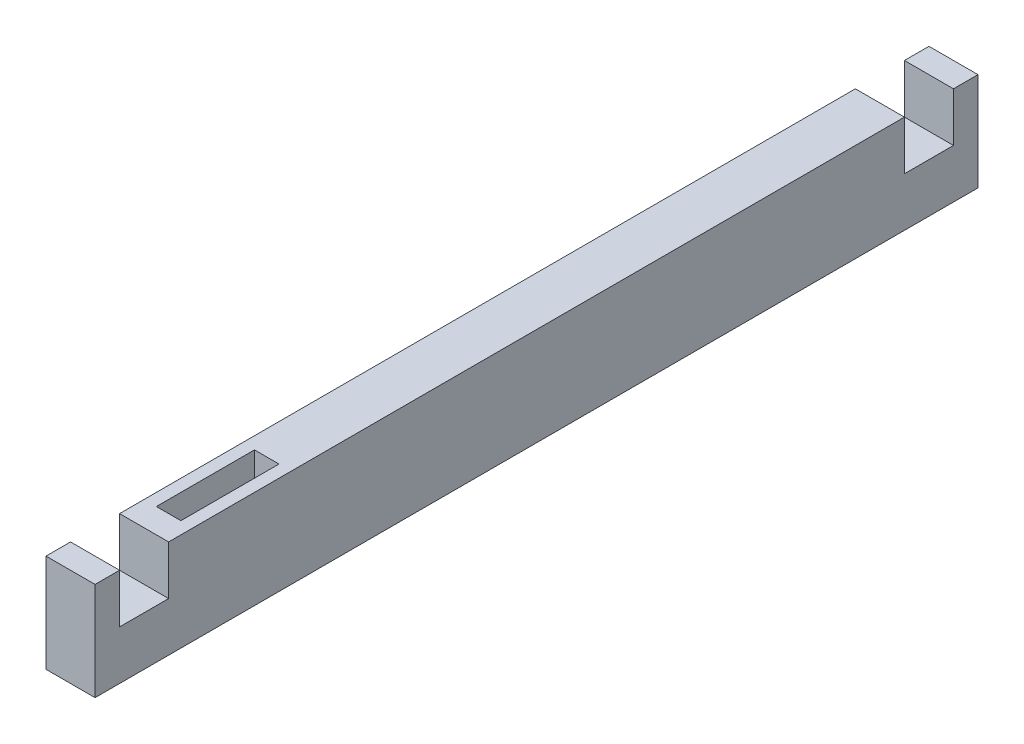
ISO-10303-21;
HEADER;
FILE_DESCRIPTION(('STEP AP214'),'2;1');
FILE_NAME('part.step','',(''),(''),'','','');
FILE_SCHEMA(('AUTOMOTIVE_DESIGN { 1 0 10303 214 1 1 1 1 }'));
ENDSEC;
DATA;
#1=APPLICATION_CONTEXT('core data for automotive mechanical design processes');
#2=APPLICATION_PROTOCOL_DEFINITION('international standard','automotive_design',2000,#1);
#3=PRODUCT_CONTEXT('',#1,'mechanical');
#4=PRODUCT('Part','Part','',(#3));
#5=PRODUCT_RELATED_PRODUCT_CATEGORY('part','',(#4));
#6=PRODUCT_DEFINITION_FORMATION('','',#4);
#7=PRODUCT_DEFINITION_CONTEXT('part definition',#1,'design');
#8=PRODUCT_DEFINITION('design','',#6,#7);
#9=PRODUCT_DEFINITION_SHAPE('','',#8);
#10=(LENGTH_UNIT() NAMED_UNIT(*) SI_UNIT(.MILLI.,.METRE.));
#11=(NAMED_UNIT(*) PLANE_ANGLE_UNIT() SI_UNIT($,.RADIAN.));
#12=(NAMED_UNIT(*) SI_UNIT($,.STERADIAN.) SOLID_ANGLE_UNIT());
#13=UNCERTAINTY_MEASURE_WITH_UNIT(LENGTH_MEASURE(1.E-05),#10,'distance_accuracy_value','');
#14=(GEOMETRIC_REPRESENTATION_CONTEXT(3) GLOBAL_UNCERTAINTY_ASSIGNED_CONTEXT((#13)) GLOBAL_UNIT_ASSIGNED_CONTEXT((#10,
#11,#12)) REPRESENTATION_CONTEXT('',''));
#15=CARTESIAN_POINT('',(0.,0.,0.));
#16=DIRECTION('',(0.,0.,1.));
#17=DIRECTION('',(1.,0.,0.));
#18=AXIS2_PLACEMENT_3D('',#15,#16,#17);
#19=CARTESIAN_POINT('',(25.4,-50.8,914.4));
#20=DIRECTION('',(-1.,0.,0.));
#21=DIRECTION('',(0.,-1.,0.));
#22=AXIS2_PLACEMENT_3D('',#19,#20,#21);
#23=PLANE('',#22);
#24=DIRECTION('',(0.,1.,0.));
#25=VECTOR('',#24,1.);
#26=CARTESIAN_POINT('',(25.4,-50.8,25.3999999999998));
#27=LINE('',#26,#25);
#28=CARTESIAN_POINT('',(25.4,0.,25.3999999999998));
#29=VERTEX_POINT('',#28);
#30=CARTESIAN_POINT('',(25.4,50.8,25.3999999999998));
#31=VERTEX_POINT('',#30);
#32=EDGE_CURVE('E214',#29,#31,#27,.T.);
#33=ORIENTED_EDGE('',*,*,#32,.F.);
#34=DIRECTION('',(0.,0.,-1.));
#35=VECTOR('',#34,1.);
#36=CARTESIAN_POINT('',(25.4,0.,914.4));
#37=LINE('',#36,#35);
#38=CARTESIAN_POINT('',(25.4,0.,76.1999999999999));
#39=VERTEX_POINT('',#38);
#40=EDGE_CURVE('E212',#39,#29,#37,.T.);
#41=ORIENTED_EDGE('',*,*,#40,.F.);
#42=DIRECTION('',(0.,-1.,0.));
#43=VECTOR('',#42,1.);
#44=CARTESIAN_POINT('',(25.4,-50.8,76.1999999999999));
#45=LINE('',#44,#43);
#46=CARTESIAN_POINT('',(25.4,50.8,76.1999999999999));
#47=VERTEX_POINT('',#46);
#48=EDGE_CURVE('E203',#47,#39,#45,.T.);
#49=ORIENTED_EDGE('',*,*,#48,.F.);
#50=DIRECTION('',(0.,0.,-1.));
#51=VECTOR('',#50,1.);
#52=CARTESIAN_POINT('',(25.4,50.8,914.4));
#53=LINE('',#52,#51);
#54=CARTESIAN_POINT('',(25.4,50.8,838.2));
#55=VERTEX_POINT('',#54);
#56=EDGE_CURVE('E50',#55,#47,#53,.T.);
#57=ORIENTED_EDGE('',*,*,#56,.F.);
#58=DIRECTION('',(0.,-1.,0.));
#59=VECTOR('',#58,1.);
#60=CARTESIAN_POINT('',(25.4,-50.8,838.2));
#61=LINE('',#60,#59);
#62=CARTESIAN_POINT('',(25.4,0.,838.2));
#63=VERTEX_POINT('',#62);
#64=EDGE_CURVE('E239',#55,#63,#61,.T.);
#65=ORIENTED_EDGE('',*,*,#64,.T.);
#66=DIRECTION('',(0.,0.,1.));
#67=VECTOR('',#66,1.);
#68=CARTESIAN_POINT('',(25.4,0.,914.4));
#69=LINE('',#68,#67);
#70=CARTESIAN_POINT('',(25.4,0.,889.));
#71=VERTEX_POINT('',#70);
#72=EDGE_CURVE('E228',#63,#71,#69,.T.);
#73=ORIENTED_EDGE('',*,*,#72,.T.);
#74=DIRECTION('',(0.,1.,0.));
#75=VECTOR('',#74,1.);
#76=CARTESIAN_POINT('',(25.4,-50.8,889.));
#77=LINE('',#76,#75);
#78=CARTESIAN_POINT('',(25.4,50.8,889.));
#79=VERTEX_POINT('',#78);
#80=EDGE_CURVE('E242',#71,#79,#77,.T.);
#81=ORIENTED_EDGE('',*,*,#80,.T.);
#82=CARTESIAN_POINT('',(25.4,50.8,914.4));
#83=VERTEX_POINT('',#82);
#84=EDGE_CURVE('E11',#83,#79,#53,.T.);
#85=ORIENTED_EDGE('',*,*,#84,.F.);
#86=DIRECTION('',(0.,1.,0.));
#87=VECTOR('',#86,1.);
#88=CARTESIAN_POINT('',(25.4,-50.8,914.4));
#89=LINE('',#88,#87);
#90=CARTESIAN_POINT('',(25.4,-50.8,914.4));
#91=VERTEX_POINT('',#90);
#92=EDGE_CURVE('E246',#91,#83,#89,.T.);
#93=ORIENTED_EDGE('',*,*,#92,.F.);
#94=DIRECTION('',(0.,0.,-1.));
#95=VECTOR('',#94,1.);
#96=CARTESIAN_POINT('',(25.4,-50.8,914.4));
#97=LINE('',#96,#95);
#98=CARTESIAN_POINT('',(25.4,-50.8,0.));
#99=VERTEX_POINT('',#98);
#100=EDGE_CURVE('E256',#91,#99,#97,.T.);
#101=ORIENTED_EDGE('',*,*,#100,.T.);
#102=DIRECTION('',(0.,1.,0.));
#103=VECTOR('',#102,1.);
#104=CARTESIAN_POINT('',(25.4,-50.8,0.));
#105=LINE('',#104,#103);
#106=CARTESIAN_POINT('',(25.4,50.8,0.));
#107=VERTEX_POINT('',#106);
#108=EDGE_CURVE('E245',#99,#107,#105,.T.);
#109=ORIENTED_EDGE('',*,*,#108,.T.);
#110=EDGE_CURVE('E51',#31,#107,#53,.T.);
#111=ORIENTED_EDGE('',*,*,#110,.F.);
#112=EDGE_LOOP('',(#33,#41,#49,#57,#65,#73,#81,#85,#93,#101,#109,#111));
#113=FACE_BOUND('',#112,.T.);
#114=ADVANCED_FACE('F43',(#113),#23,.F.);
#115=CARTESIAN_POINT('',(-25.4,50.8,914.4));
#116=DIRECTION('',(0.,-1.,0.));
#117=DIRECTION('',(0.,0.,-1.));
#118=AXIS2_PLACEMENT_3D('',#115,#116,#117);
#119=PLANE('',#118);
#120=DIRECTION('',(1.,0.,0.));
#121=VECTOR('',#120,1.);
#122=CARTESIAN_POINT('',(-25.4,50.8,25.3999999999998));
#123=LINE('',#122,#121);
#124=CARTESIAN_POINT('',(-25.4,50.8,25.3999999999998));
#125=VERTEX_POINT('',#124);
#126=EDGE_CURVE('E199',#125,#31,#123,.T.);
#127=ORIENTED_EDGE('',*,*,#126,.T.);
#128=ORIENTED_EDGE('',*,*,#110,.T.);
#129=DIRECTION('',(-1.,0.,0.));
#130=VECTOR('',#129,1.);
#131=CARTESIAN_POINT('',(-25.4,50.8,0.));
#132=LINE('',#131,#130);
#133=CARTESIAN_POINT('',(-25.4,50.8,0.));
#134=VERTEX_POINT('',#133);
#135=EDGE_CURVE('E259',#107,#134,#132,.T.);
#136=ORIENTED_EDGE('',*,*,#135,.T.);
#137=DIRECTION('',(0.,0.,-1.));
#138=VECTOR('',#137,1.);
#139=CARTESIAN_POINT('',(-25.4,50.8,914.4));
#140=LINE('',#139,#138);
#141=EDGE_CURVE('E269',#125,#134,#140,.T.);
#142=ORIENTED_EDGE('',*,*,#141,.F.);
#143=EDGE_LOOP('',(#127,#128,#136,#142));
#144=FACE_BOUND('',#143,.T.);
#145=ADVANCED_FACE('F285',(#144),#119,.F.);
#146=DIRECTION('',(1.,0.,0.));
#147=VECTOR('',#146,1.);
#148=CARTESIAN_POINT('',(-12.7,50.8,711.2));
#149=LINE('',#148,#147);
#150=CARTESIAN_POINT('',(-12.7,50.8,711.2));
#151=VERTEX_POINT('',#150);
#152=CARTESIAN_POINT('',(12.7,50.8,711.2));
#153=VERTEX_POINT('',#152);
#154=EDGE_CURVE('E164',#151,#153,#149,.T.);
#155=ORIENTED_EDGE('',*,*,#154,.T.);
#156=DIRECTION('',(0.,0.,1.));
#157=VECTOR('',#156,1.);
#158=CARTESIAN_POINT('',(12.7,50.8,812.8));
#159=LINE('',#158,#157);
#160=CARTESIAN_POINT('',(12.7,50.8,812.8));
#161=VERTEX_POINT('',#160);
#162=EDGE_CURVE('E158',#153,#161,#159,.T.);
#163=ORIENTED_EDGE('',*,*,#162,.T.);
#164=DIRECTION('',(-1.,0.,0.));
#165=VECTOR('',#164,1.);
#166=CARTESIAN_POINT('',(-12.7,50.8,812.8));
#167=LINE('',#166,#165);
#168=CARTESIAN_POINT('',(-12.7,50.8,812.8));
#169=VERTEX_POINT('',#168);
#170=EDGE_CURVE('E167',#161,#169,#167,.T.);
#171=ORIENTED_EDGE('',*,*,#170,.T.);
#172=DIRECTION('',(0.,0.,-1.));
#173=VECTOR('',#172,1.);
#174=CARTESIAN_POINT('',(-12.7,50.8,812.8));
#175=LINE('',#174,#173);
#176=EDGE_CURVE('E58',#169,#151,#175,.T.);
#177=ORIENTED_EDGE('',*,*,#176,.T.);
#178=EDGE_LOOP('',(#155,#163,#171,#177));
#179=FACE_BOUND('',#178,.T.);
#180=DIRECTION('',(1.,0.,0.));
#181=VECTOR('',#180,1.);
#182=CARTESIAN_POINT('',(-25.4,50.8,76.1999999999999));
#183=LINE('',#182,#181);
#184=CARTESIAN_POINT('',(-25.4,50.8,76.1999999999999));
#185=VERTEX_POINT('',#184);
#186=EDGE_CURVE('E207',#185,#47,#183,.T.);
#187=ORIENTED_EDGE('',*,*,#186,.F.);
#188=CARTESIAN_POINT('',(-25.4,50.8,838.2));
#189=VERTEX_POINT('',#188);
#190=EDGE_CURVE('E272',#189,#185,#140,.T.);
#191=ORIENTED_EDGE('',*,*,#190,.F.);
#192=DIRECTION('',(1.,0.,0.));
#193=VECTOR('',#192,1.);
#194=CARTESIAN_POINT('',(-25.4,50.8,838.2));
#195=LINE('',#194,#193);
#196=EDGE_CURVE('E229',#189,#55,#195,.T.);
#197=ORIENTED_EDGE('',*,*,#196,.T.);
#198=ORIENTED_EDGE('',*,*,#56,.T.);
#199=EDGE_LOOP('',(#187,#191,#197,#198));
#200=FACE_BOUND('',#199,.T.);
#201=ADVANCED_FACE('F171',(#179,#200),#119,.F.);
#202=CARTESIAN_POINT('',(-25.4,-50.8,914.4));
#203=DIRECTION('',(1.,0.,0.));
#204=DIRECTION('',(0.,0.,-1.));
#205=AXIS2_PLACEMENT_3D('',#202,#203,#204);
#206=PLANE('',#205);
#207=DIRECTION('',(0.,-1.,0.));
#208=VECTOR('',#207,1.);
#209=CARTESIAN_POINT('',(-25.4,50.8,25.3999999999998));
#210=LINE('',#209,#208);
#211=CARTESIAN_POINT('',(-25.4,0.,25.3999999999998));
#212=VERTEX_POINT('',#211);
#213=EDGE_CURVE('E189',#125,#212,#210,.T.);
#214=ORIENTED_EDGE('',*,*,#213,.F.);
#215=ORIENTED_EDGE('',*,*,#141,.T.);
#216=DIRECTION('',(0.,-1.,0.));
#217=VECTOR('',#216,1.);
#218=CARTESIAN_POINT('',(-25.4,-50.8,0.));
#219=LINE('',#218,#217);
#220=CARTESIAN_POINT('',(-25.4,-50.8,0.));
#221=VERTEX_POINT('',#220);
#222=EDGE_CURVE('E262',#134,#221,#219,.T.);
#223=ORIENTED_EDGE('',*,*,#222,.T.);
#224=DIRECTION('',(0.,0.,-1.));
#225=VECTOR('',#224,1.);
#226=CARTESIAN_POINT('',(-25.4,-50.8,914.4));
#227=LINE('',#226,#225);
#228=CARTESIAN_POINT('',(-25.4,-50.8,914.4));
#229=VERTEX_POINT('',#228);
#230=EDGE_CURVE('E267',#229,#221,#227,.T.);
#231=ORIENTED_EDGE('',*,*,#230,.F.);
#232=DIRECTION('',(0.,-1.,0.));
#233=VECTOR('',#232,1.);
#234=CARTESIAN_POINT('',(-25.4,-50.8,914.4));
#235=LINE('',#234,#233);
#236=CARTESIAN_POINT('',(-25.4,50.8,914.4));
#237=VERTEX_POINT('',#236);
#238=EDGE_CURVE('E252',#237,#229,#235,.T.);
#239=ORIENTED_EDGE('',*,*,#238,.F.);
#240=CARTESIAN_POINT('',(-25.4,50.8,889.));
#241=VERTEX_POINT('',#240);
#242=EDGE_CURVE('E270',#237,#241,#140,.T.);
#243=ORIENTED_EDGE('',*,*,#242,.T.);
#244=DIRECTION('',(0.,-1.,0.));
#245=VECTOR('',#244,1.);
#246=CARTESIAN_POINT('',(-25.4,50.8,889.));
#247=LINE('',#246,#245);
#248=CARTESIAN_POINT('',(-25.4,0.,889.));
#249=VERTEX_POINT('',#248);
#250=EDGE_CURVE('E216',#241,#249,#247,.T.);
#251=ORIENTED_EDGE('',*,*,#250,.T.);
#252=DIRECTION('',(0.,0.,-1.));
#253=VECTOR('',#252,1.);
#254=CARTESIAN_POINT('',(-25.4,0.,889.));
#255=LINE('',#254,#253);
#256=CARTESIAN_POINT('',(-25.4,0.,838.2));
#257=VERTEX_POINT('',#256);
#258=EDGE_CURVE('E219',#249,#257,#255,.T.);
#259=ORIENTED_EDGE('',*,*,#258,.T.);
#260=DIRECTION('',(0.,1.,0.));
#261=VECTOR('',#260,1.);
#262=CARTESIAN_POINT('',(-25.4,50.8,838.2));
#263=LINE('',#262,#261);
#264=EDGE_CURVE('E222',#257,#189,#263,.T.);
#265=ORIENTED_EDGE('',*,*,#264,.T.);
#266=ORIENTED_EDGE('',*,*,#190,.T.);
#267=DIRECTION('',(0.,1.,0.));
#268=VECTOR('',#267,1.);
#269=CARTESIAN_POINT('',(-25.4,50.8,76.1999999999999));
#270=LINE('',#269,#268);
#271=CARTESIAN_POINT('',(-25.4,0.,76.1999999999999));
#272=VERTEX_POINT('',#271);
#273=EDGE_CURVE('E194',#272,#185,#270,.T.);
#274=ORIENTED_EDGE('',*,*,#273,.F.);
#275=DIRECTION('',(0.,0.,1.));
#276=VECTOR('',#275,1.);
#277=CARTESIAN_POINT('',(-25.4,0.,25.3999999999998));
#278=LINE('',#277,#276);
#279=EDGE_CURVE('E196',#212,#272,#278,.T.);
#280=ORIENTED_EDGE('',*,*,#279,.F.);
#281=EDGE_LOOP('',(#214,#215,#223,#231,#239,#243,#251,#259,#265,#266,#274,#280));
#282=FACE_BOUND('',#281,.T.);
#283=ADVANCED_FACE('F279',(#282),#206,.F.);
#284=ORIENTED_EDGE('',*,*,#84,.T.);
#285=DIRECTION('',(1.,0.,0.));
#286=VECTOR('',#285,1.);
#287=CARTESIAN_POINT('',(-25.4,50.8,889.));
#288=LINE('',#287,#286);
#289=EDGE_CURVE('E226',#241,#79,#288,.T.);
#290=ORIENTED_EDGE('',*,*,#289,.F.);
#291=ORIENTED_EDGE('',*,*,#242,.F.);
#292=DIRECTION('',(-1.,0.,0.));
#293=VECTOR('',#292,1.);
#294=CARTESIAN_POINT('',(-25.4,50.8,914.4));
#295=LINE('',#294,#293);
#296=EDGE_CURVE('E249',#83,#237,#295,.T.);
#297=ORIENTED_EDGE('',*,*,#296,.F.);
#298=EDGE_LOOP('',(#284,#290,#291,#297));
#299=FACE_BOUND('',#298,.T.);
#300=ADVANCED_FACE('F303',(#299),#119,.F.);
#301=CARTESIAN_POINT('',(-25.4,-50.8,914.4));
#302=DIRECTION('',(0.,1.,0.));
#303=DIRECTION('',(0.,0.,1.));
#304=AXIS2_PLACEMENT_3D('',#301,#302,#303);
#305=PLANE('',#304);
#306=DIRECTION('',(-1.,0.,0.));
#307=VECTOR('',#306,1.);
#308=CARTESIAN_POINT('',(-12.7,-50.8,812.8));
#309=LINE('',#308,#307);
#310=CARTESIAN_POINT('',(12.7,-50.8,812.8));
#311=VERTEX_POINT('',#310);
#312=CARTESIAN_POINT('',(-12.7,-50.8,812.8));
#313=VERTEX_POINT('',#312);
#314=EDGE_CURVE('E183',#311,#313,#309,.T.);
#315=ORIENTED_EDGE('',*,*,#314,.F.);
#316=DIRECTION('',(0.,0.,1.));
#317=VECTOR('',#316,1.);
#318=CARTESIAN_POINT('',(12.7,-50.8,812.8));
#319=LINE('',#318,#317);
#320=CARTESIAN_POINT('',(12.7,-50.8,711.2));
#321=VERTEX_POINT('',#320);
#322=EDGE_CURVE('E66',#321,#311,#319,.T.);
#323=ORIENTED_EDGE('',*,*,#322,.F.);
#324=DIRECTION('',(1.,0.,0.));
#325=VECTOR('',#324,1.);
#326=CARTESIAN_POINT('',(-12.7,-50.8,711.2));
#327=LINE('',#326,#325);
#328=CARTESIAN_POINT('',(-12.7,-50.8,711.2));
#329=VERTEX_POINT('',#328);
#330=EDGE_CURVE('E174',#329,#321,#327,.T.);
#331=ORIENTED_EDGE('',*,*,#330,.F.);
#332=DIRECTION('',(0.,0.,-1.));
#333=VECTOR('',#332,1.);
#334=CARTESIAN_POINT('',(-12.7,-50.8,812.8));
#335=LINE('',#334,#333);
#336=EDGE_CURVE('E177',#313,#329,#335,.T.);
#337=ORIENTED_EDGE('',*,*,#336,.F.);
#338=EDGE_LOOP('',(#315,#323,#331,#337));
#339=FACE_BOUND('',#338,.T.);
#340=DIRECTION('',(1.,0.,0.));
#341=VECTOR('',#340,1.);
#342=CARTESIAN_POINT('',(-25.4,-50.8,0.));
#343=LINE('',#342,#341);
#344=EDGE_CURVE('E250',#221,#99,#343,.T.);
#345=ORIENTED_EDGE('',*,*,#344,.T.);
#346=ORIENTED_EDGE('',*,*,#100,.F.);
#347=DIRECTION('',(1.,0.,0.));
#348=VECTOR('',#347,1.);
#349=CARTESIAN_POINT('',(-25.4,-50.8,914.4));
#350=LINE('',#349,#348);
#351=EDGE_CURVE('E254',#229,#91,#350,.T.);
#352=ORIENTED_EDGE('',*,*,#351,.F.);
#353=ORIENTED_EDGE('',*,*,#230,.T.);
#354=EDGE_LOOP('',(#345,#346,#352,#353));
#355=FACE_BOUND('',#354,.T.);
#356=ADVANCED_FACE('F293',(#339,#355),#305,.F.);
#357=CARTESIAN_POINT('',(0.,0.,914.4));
#358=DIRECTION('',(0.,0.,-1.));
#359=DIRECTION('',(-1.,0.,0.));
#360=AXIS2_PLACEMENT_3D('',#357,#358,#359);
#361=PLANE('',#360);
#362=ORIENTED_EDGE('',*,*,#92,.T.);
#363=ORIENTED_EDGE('',*,*,#296,.T.);
#364=ORIENTED_EDGE('',*,*,#238,.T.);
#365=ORIENTED_EDGE('',*,*,#351,.T.);
#366=EDGE_LOOP('',(#362,#363,#364,#365));
#367=FACE_BOUND('',#366,.T.);
#368=ADVANCED_FACE('F300',(#367),#361,.F.);
#369=CARTESIAN_POINT('',(0.,0.,0.));
#370=DIRECTION('',(0.,0.,-1.));
#371=DIRECTION('',(-1.,0.,0.));
#372=AXIS2_PLACEMENT_3D('',#369,#370,#371);
#373=PLANE('',#372);
#374=ORIENTED_EDGE('',*,*,#108,.F.);
#375=ORIENTED_EDGE('',*,*,#344,.F.);
#376=ORIENTED_EDGE('',*,*,#222,.F.);
#377=ORIENTED_EDGE('',*,*,#135,.F.);
#378=EDGE_LOOP('',(#374,#375,#376,#377));
#379=FACE_BOUND('',#378,.T.);
#380=ADVANCED_FACE('F290',(#379),#373,.T.);
#381=CARTESIAN_POINT('',(-25.4,50.8,889.));
#382=DIRECTION('',(0.,0.,1.));
#383=DIRECTION('',(1.,0.,0.));
#384=AXIS2_PLACEMENT_3D('',#381,#382,#383);
#385=PLANE('',#384);
#386=DIRECTION('',(1.,0.,0.));
#387=VECTOR('',#386,1.);
#388=CARTESIAN_POINT('',(-25.4,0.,889.));
#389=LINE('',#388,#387);
#390=EDGE_CURVE('E225',#249,#71,#389,.T.);
#391=ORIENTED_EDGE('',*,*,#390,.F.);
#392=ORIENTED_EDGE('',*,*,#250,.F.);
#393=ORIENTED_EDGE('',*,*,#289,.T.);
#394=ORIENTED_EDGE('',*,*,#80,.F.);
#395=EDGE_LOOP('',(#391,#392,#393,#394));
#396=FACE_BOUND('',#395,.T.);
#397=ADVANCED_FACE('F305',(#396),#385,.F.);
#398=CARTESIAN_POINT('',(-25.4,50.8,838.2));
#399=DIRECTION('',(0.,0.,-1.));
#400=DIRECTION('',(-1.,0.,0.));
#401=AXIS2_PLACEMENT_3D('',#398,#399,#400);
#402=PLANE('',#401);
#403=ORIENTED_EDGE('',*,*,#196,.F.);
#404=ORIENTED_EDGE('',*,*,#264,.F.);
#405=DIRECTION('',(1.,0.,0.));
#406=VECTOR('',#405,1.);
#407=CARTESIAN_POINT('',(-25.4,0.,838.2));
#408=LINE('',#407,#406);
#409=EDGE_CURVE('E232',#257,#63,#408,.T.);
#410=ORIENTED_EDGE('',*,*,#409,.T.);
#411=ORIENTED_EDGE('',*,*,#64,.F.);
#412=EDGE_LOOP('',(#403,#404,#410,#411));
#413=FACE_BOUND('',#412,.T.);
#414=ADVANCED_FACE('F312',(#413),#402,.F.);
#415=CARTESIAN_POINT('',(-25.4,0.,889.));
#416=DIRECTION('',(0.,-1.,0.));
#417=DIRECTION('',(1.,0.,0.));
#418=AXIS2_PLACEMENT_3D('',#415,#416,#417);
#419=PLANE('',#418);
#420=ORIENTED_EDGE('',*,*,#409,.F.);
#421=ORIENTED_EDGE('',*,*,#258,.F.);
#422=ORIENTED_EDGE('',*,*,#390,.T.);
#423=ORIENTED_EDGE('',*,*,#72,.F.);
#424=EDGE_LOOP('',(#420,#421,#422,#423));
#425=FACE_BOUND('',#424,.T.);
#426=ADVANCED_FACE('F309',(#425),#419,.F.);
#427=CARTESIAN_POINT('',(-25.4,50.8,25.3999999999998));
#428=DIRECTION('',(0.,0.,1.));
#429=DIRECTION('',(1.,0.,0.));
#430=AXIS2_PLACEMENT_3D('',#427,#428,#429);
#431=PLANE('',#430);
#432=ORIENTED_EDGE('',*,*,#32,.T.);
#433=ORIENTED_EDGE('',*,*,#126,.F.);
#434=ORIENTED_EDGE('',*,*,#213,.T.);
#435=DIRECTION('',(1.,0.,0.));
#436=VECTOR('',#435,1.);
#437=CARTESIAN_POINT('',(-25.4,0.,25.3999999999998));
#438=LINE('',#437,#436);
#439=EDGE_CURVE('E200',#212,#29,#438,.T.);
#440=ORIENTED_EDGE('',*,*,#439,.T.);
#441=EDGE_LOOP('',(#432,#433,#434,#440));
#442=FACE_BOUND('',#441,.T.);
#443=ADVANCED_FACE('F325',(#442),#431,.T.);
#444=CARTESIAN_POINT('',(-25.4,0.,25.3999999999998));
#445=DIRECTION('',(0.,1.,0.));
#446=DIRECTION('',(-1.,0.,0.));
#447=AXIS2_PLACEMENT_3D('',#444,#445,#446);
#448=PLANE('',#447);
#449=ORIENTED_EDGE('',*,*,#40,.T.);
#450=ORIENTED_EDGE('',*,*,#439,.F.);
#451=ORIENTED_EDGE('',*,*,#279,.T.);
#452=DIRECTION('',(1.,0.,0.));
#453=VECTOR('',#452,1.);
#454=CARTESIAN_POINT('',(-25.4,0.,76.1999999999999));
#455=LINE('',#454,#453);
#456=EDGE_CURVE('E204',#272,#39,#455,.T.);
#457=ORIENTED_EDGE('',*,*,#456,.T.);
#458=EDGE_LOOP('',(#449,#450,#451,#457));
#459=FACE_BOUND('',#458,.T.);
#460=ADVANCED_FACE('F323',(#459),#448,.T.);
#461=CARTESIAN_POINT('',(-25.4,50.8,76.1999999999999));
#462=DIRECTION('',(0.,0.,-1.));
#463=DIRECTION('',(-1.,0.,0.));
#464=AXIS2_PLACEMENT_3D('',#461,#462,#463);
#465=PLANE('',#464);
#466=ORIENTED_EDGE('',*,*,#48,.T.);
#467=ORIENTED_EDGE('',*,*,#456,.F.);
#468=ORIENTED_EDGE('',*,*,#273,.T.);
#469=ORIENTED_EDGE('',*,*,#186,.T.);
#470=EDGE_LOOP('',(#466,#467,#468,#469));
#471=FACE_BOUND('',#470,.T.);
#472=ADVANCED_FACE('F319',(#471),#465,.T.);
#473=CARTESIAN_POINT('',(12.7,50.8,812.8));
#474=DIRECTION('',(1.,0.,0.));
#475=DIRECTION('',(0.,0.,-1.));
#476=AXIS2_PLACEMENT_3D('',#473,#474,#475);
#477=PLANE('',#476);
#478=ORIENTED_EDGE('',*,*,#322,.T.);
#479=DIRECTION('',(0.,-1.,0.));
#480=VECTOR('',#479,1.);
#481=CARTESIAN_POINT('',(12.7,50.8,812.8));
#482=LINE('',#481,#480);
#483=EDGE_CURVE('E154',#161,#311,#482,.T.);
#484=ORIENTED_EDGE('',*,*,#483,.F.);
#485=ORIENTED_EDGE('',*,*,#162,.F.);
#486=DIRECTION('',(0.,-1.,0.));
#487=VECTOR('',#486,1.);
#488=CARTESIAN_POINT('',(12.7,50.8,711.2));
#489=LINE('',#488,#487);
#490=EDGE_CURVE('E187',#153,#321,#489,.T.);
#491=ORIENTED_EDGE('',*,*,#490,.T.);
#492=EDGE_LOOP('',(#478,#484,#485,#491));
#493=FACE_BOUND('',#492,.T.);
#494=ADVANCED_FACE('F156',(#493),#477,.F.);
#495=CARTESIAN_POINT('',(-12.7,50.8,711.2));
#496=DIRECTION('',(0.,0.,-1.));
#497=DIRECTION('',(-1.,0.,0.));
#498=AXIS2_PLACEMENT_3D('',#495,#496,#497);
#499=PLANE('',#498);
#500=ORIENTED_EDGE('',*,*,#330,.T.);
#501=ORIENTED_EDGE('',*,*,#490,.F.);
#502=ORIENTED_EDGE('',*,*,#154,.F.);
#503=DIRECTION('',(0.,-1.,0.));
#504=VECTOR('',#503,1.);
#505=CARTESIAN_POINT('',(-12.7,50.8,711.2));
#506=LINE('',#505,#504);
#507=EDGE_CURVE('E190',#151,#329,#506,.T.);
#508=ORIENTED_EDGE('',*,*,#507,.T.);
#509=EDGE_LOOP('',(#500,#501,#502,#508));
#510=FACE_BOUND('',#509,.T.);
#511=ADVANCED_FACE('F418',(#510),#499,.F.);
#512=CARTESIAN_POINT('',(-12.7,50.8,812.8));
#513=DIRECTION('',(-1.,0.,0.));
#514=DIRECTION('',(0.,0.,1.));
#515=AXIS2_PLACEMENT_3D('',#512,#513,#514);
#516=PLANE('',#515);
#517=ORIENTED_EDGE('',*,*,#336,.T.);
#518=ORIENTED_EDGE('',*,*,#507,.F.);
#519=ORIENTED_EDGE('',*,*,#176,.F.);
#520=DIRECTION('',(0.,-1.,0.));
#521=VECTOR('',#520,1.);
#522=CARTESIAN_POINT('',(-12.7,50.8,812.8));
#523=LINE('',#522,#521);
#524=EDGE_CURVE('E163',#169,#313,#523,.T.);
#525=ORIENTED_EDGE('',*,*,#524,.T.);
#526=EDGE_LOOP('',(#517,#518,#519,#525));
#527=FACE_BOUND('',#526,.T.);
#528=ADVANCED_FACE('F428',(#527),#516,.F.);
#529=CARTESIAN_POINT('',(-12.7,50.8,812.8));
#530=DIRECTION('',(0.,0.,1.));
#531=DIRECTION('',(1.,0.,0.));
#532=AXIS2_PLACEMENT_3D('',#529,#530,#531);
#533=PLANE('',#532);
#534=ORIENTED_EDGE('',*,*,#314,.T.);
#535=ORIENTED_EDGE('',*,*,#524,.F.);
#536=ORIENTED_EDGE('',*,*,#170,.F.);
#537=ORIENTED_EDGE('',*,*,#483,.T.);
#538=EDGE_LOOP('',(#534,#535,#536,#537));
#539=FACE_BOUND('',#538,.T.);
#540=ADVANCED_FACE('F168',(#539),#533,.F.);
#541=CLOSED_SHELL('',(#114,#145,#201,#283,#300,#356,#368,#380,#397,#414,#426,#443,#460,#472,
#494,#511,#528,#540));
#542=MANIFOLD_SOLID_BREP('B2',#541);
#543=ADVANCED_BREP_SHAPE_REPRESENTATION('',(#18,#542),#14);
#544=SHAPE_DEFINITION_REPRESENTATION(#9,#543);
ENDSEC;
END-ISO-10303-21;
